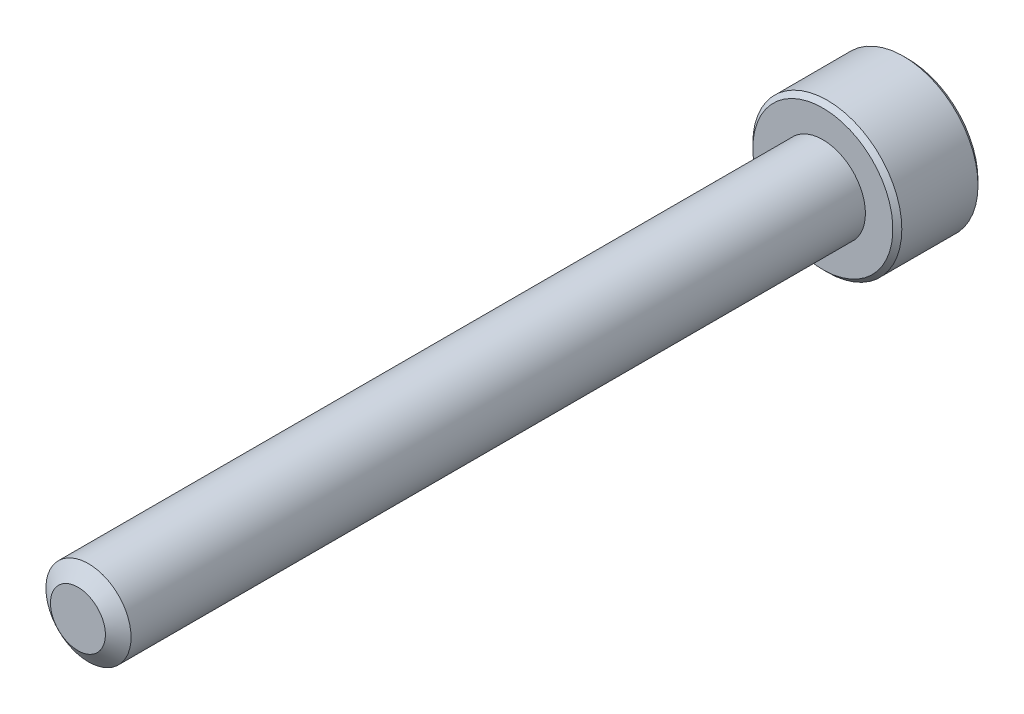
ISO-10303-21;
HEADER;
FILE_DESCRIPTION(('STEP AP214'),'2;1');
FILE_NAME('part.step','',(''),(''),'','','');
FILE_SCHEMA(('AUTOMOTIVE_DESIGN { 1 0 10303 214 1 1 1 1 }'));
ENDSEC;
DATA;
#1=APPLICATION_CONTEXT('core data for automotive mechanical design processes');
#2=APPLICATION_PROTOCOL_DEFINITION('international standard','automotive_design',2000,#1);
#3=PRODUCT_CONTEXT('',#1,'mechanical');
#4=PRODUCT('Part','Part','',(#3));
#5=PRODUCT_RELATED_PRODUCT_CATEGORY('part','',(#4));
#6=PRODUCT_DEFINITION_FORMATION('','',#4);
#7=PRODUCT_DEFINITION_CONTEXT('part definition',#1,'design');
#8=PRODUCT_DEFINITION('design','',#6,#7);
#9=PRODUCT_DEFINITION_SHAPE('','',#8);
#10=(LENGTH_UNIT() NAMED_UNIT(*) SI_UNIT(.MILLI.,.METRE.));
#11=(NAMED_UNIT(*) PLANE_ANGLE_UNIT() SI_UNIT($,.RADIAN.));
#12=(NAMED_UNIT(*) SI_UNIT($,.STERADIAN.) SOLID_ANGLE_UNIT());
#13=UNCERTAINTY_MEASURE_WITH_UNIT(LENGTH_MEASURE(1.E-05),#10,'distance_accuracy_value','');
#14=(GEOMETRIC_REPRESENTATION_CONTEXT(3) GLOBAL_UNCERTAINTY_ASSIGNED_CONTEXT((#13)) GLOBAL_UNIT_ASSIGNED_CONTEXT((#10,
#11,#12)) REPRESENTATION_CONTEXT('',''));
#15=CARTESIAN_POINT('',(0.,0.,0.));
#16=DIRECTION('',(0.,0.,1.));
#17=DIRECTION('',(1.,0.,0.));
#18=AXIS2_PLACEMENT_3D('',#15,#16,#17);
#19=CARTESIAN_POINT('',(0.,0.,-35.));
#20=DIRECTION('',(0.,0.,1.));
#21=DIRECTION('',(1.,0.,0.));
#22=AXIS2_PLACEMENT_3D('',#19,#20,#21);
#23=CYLINDRICAL_SURFACE('',#22,2.);
#24=CARTESIAN_POINT('',(0.,0.,-0.496211410611026));
#25=DIRECTION('',(0.,0.,1.));
#26=DIRECTION('',(1.,0.,0.));
#27=AXIS2_PLACEMENT_3D('',#24,#25,#26);
#28=CIRCLE('',#27,2.);
#29=CARTESIAN_POINT('',(2.,0.,-0.496211410611026));
#30=VERTEX_POINT('',#29);
#31=EDGE_CURVE('E120',#30,#30,#28,.T.);
#32=ORIENTED_EDGE('',*,*,#31,.F.);
#33=EDGE_LOOP('',(#32));
#34=FACE_BOUND('',#33,.T.);
#35=CARTESIAN_POINT('',(0.,0.,-35.));
#36=DIRECTION('',(0.,0.,-1.));
#37=DIRECTION('',(-1.,0.,0.));
#38=AXIS2_PLACEMENT_3D('',#35,#36,#37);
#39=CIRCLE('',#38,2.);
#40=CARTESIAN_POINT('',(-2.,0.,-35.));
#41=VERTEX_POINT('',#40);
#42=EDGE_CURVE('E231',#41,#41,#39,.F.);
#43=ORIENTED_EDGE('',*,*,#42,.T.);
#44=EDGE_LOOP('',(#43));
#45=FACE_BOUND('',#44,.T.);
#46=ADVANCED_FACE('F40',(#34,#45),#23,.T.);
#47=CARTESIAN_POINT('',(0.,0.,0.));
#48=DIRECTION('',(0.,0.,-1.));
#49=DIRECTION('',(-1.,0.,0.));
#50=AXIS2_PLACEMENT_3D('',#47,#48,#49);
#51=CONICAL_SURFACE('',#50,1.29133666301317,0.959931088596884);
#52=ORIENTED_EDGE('',*,*,#31,.T.);
#53=EDGE_LOOP('',(#52));
#54=FACE_BOUND('',#53,.T.);
#55=CARTESIAN_POINT('',(0.,0.,0.));
#56=DIRECTION('',(0.,0.,1.));
#57=DIRECTION('',(1.,0.,0.));
#58=AXIS2_PLACEMENT_3D('',#55,#56,#57);
#59=CIRCLE('',#58,1.29133666301317);
#60=CARTESIAN_POINT('',(1.29133666301317,0.,0.));
#61=VERTEX_POINT('',#60);
#62=EDGE_CURVE('E228',#61,#61,#59,.T.);
#63=ORIENTED_EDGE('',*,*,#62,.F.);
#64=EDGE_LOOP('',(#63));
#65=FACE_BOUND('',#64,.T.);
#66=ADVANCED_FACE('F211',(#54,#65),#51,.T.);
#67=CARTESIAN_POINT('',(0.,0.,0.));
#68=DIRECTION('',(0.,0.,1.));
#69=DIRECTION('',(1.,0.,0.));
#70=AXIS2_PLACEMENT_3D('',#67,#68,#69);
#71=PLANE('',#70);
#72=ORIENTED_EDGE('',*,*,#62,.T.);
#73=EDGE_LOOP('',(#72));
#74=FACE_BOUND('',#73,.T.);
#75=ADVANCED_FACE('F208',(#74),#71,.T.);
#76=CARTESIAN_POINT('',(0.,0.,-39.));
#77=DIRECTION('',(0.,0.,1.));
#78=DIRECTION('',(1.,0.,0.));
#79=AXIS2_PLACEMENT_3D('',#76,#77,#78);
#80=CYLINDRICAL_SURFACE('',#79,3.5);
#81=CARTESIAN_POINT('',(0.,0.,-38.79));
#82=DIRECTION('',(0.,0.,-1.));
#83=DIRECTION('',(-1.,0.,0.));
#84=AXIS2_PLACEMENT_3D('',#81,#82,#83);
#85=CIRCLE('',#84,3.5);
#86=CARTESIAN_POINT('',(3.5,0.,-38.79));
#87=VERTEX_POINT('',#86);
#88=EDGE_CURVE('E49',#87,#87,#85,.F.);
#89=CARTESIAN_POINT('',(0.,0.,-35.21));
#90=DIRECTION('',(0.,0.,-1.));
#91=DIRECTION('',(-1.,0.,0.));
#92=AXIS2_PLACEMENT_3D('',#89,#90,#91);
#93=CIRCLE('',#92,3.5);
#94=CARTESIAN_POINT('',(3.5,0.,-35.21));
#95=VERTEX_POINT('',#94);
#96=EDGE_CURVE('E185',#95,#95,#93,.T.);
#97=CARTESIAN_POINT('',(3.5,0.,-38.79));
#98=CARTESIAN_POINT('',(3.5,0.,-38.7527083333333));
#99=CARTESIAN_POINT('',(3.5,0.,-38.7154166666667));
#100=CARTESIAN_POINT('',(3.5,0.,-38.6408333333333));
#101=CARTESIAN_POINT('',(3.5,0.,-38.6035416666667));
#102=CARTESIAN_POINT('',(3.5,0.,-38.5289583333333));
#103=CARTESIAN_POINT('',(3.5,0.,-38.4916666666667));
#104=CARTESIAN_POINT('',(3.5,0.,-38.4170833333333));
#105=CARTESIAN_POINT('',(3.5,0.,-38.3797916666667));
#106=CARTESIAN_POINT('',(3.5,0.,-38.3052083333333));
#107=CARTESIAN_POINT('',(3.5,0.,-38.2679166666667));
#108=CARTESIAN_POINT('',(3.5,0.,-38.1933333333333));
#109=CARTESIAN_POINT('',(3.5,0.,-38.1560416666667));
#110=CARTESIAN_POINT('',(3.5,0.,-38.0814583333333));
#111=CARTESIAN_POINT('',(3.5,0.,-38.0441666666667));
#112=CARTESIAN_POINT('',(3.5,0.,-37.9695833333333));
#113=CARTESIAN_POINT('',(3.5,0.,-37.9322916666667));
#114=CARTESIAN_POINT('',(3.5,0.,-37.8577083333333));
#115=CARTESIAN_POINT('',(3.5,0.,-37.8204166666667));
#116=CARTESIAN_POINT('',(3.5,0.,-37.7458333333333));
#117=CARTESIAN_POINT('',(3.5,0.,-37.7085416666667));
#118=CARTESIAN_POINT('',(3.5,0.,-37.6339583333333));
#119=CARTESIAN_POINT('',(3.5,0.,-37.5966666666667));
#120=CARTESIAN_POINT('',(3.5,0.,-37.5220833333333));
#121=CARTESIAN_POINT('',(3.5,0.,-37.4847916666667));
#122=CARTESIAN_POINT('',(3.5,0.,-37.4102083333333));
#123=CARTESIAN_POINT('',(3.5,0.,-37.3729166666667));
#124=CARTESIAN_POINT('',(3.5,0.,-37.2983333333333));
#125=CARTESIAN_POINT('',(3.5,0.,-37.2610416666667));
#126=CARTESIAN_POINT('',(3.5,0.,-37.1864583333333));
#127=CARTESIAN_POINT('',(3.5,0.,-37.1491666666667));
#128=CARTESIAN_POINT('',(3.5,0.,-37.0745833333333));
#129=CARTESIAN_POINT('',(3.5,0.,-37.0372916666667));
#130=CARTESIAN_POINT('',(3.5,0.,-36.9627083333333));
#131=CARTESIAN_POINT('',(3.5,0.,-36.9254166666667));
#132=CARTESIAN_POINT('',(3.5,0.,-36.8508333333333));
#133=CARTESIAN_POINT('',(3.5,0.,-36.8135416666667));
#134=CARTESIAN_POINT('',(3.5,0.,-36.7389583333333));
#135=CARTESIAN_POINT('',(3.5,0.,-36.7016666666667));
#136=CARTESIAN_POINT('',(3.5,0.,-36.6270833333333));
#137=CARTESIAN_POINT('',(3.5,0.,-36.5897916666667));
#138=CARTESIAN_POINT('',(3.5,0.,-36.5152083333333));
#139=CARTESIAN_POINT('',(3.5,0.,-36.4779166666667));
#140=CARTESIAN_POINT('',(3.5,0.,-36.4033333333333));
#141=CARTESIAN_POINT('',(3.5,0.,-36.3660416666667));
#142=CARTESIAN_POINT('',(3.5,0.,-36.2914583333333));
#143=CARTESIAN_POINT('',(3.5,0.,-36.2541666666667));
#144=CARTESIAN_POINT('',(3.5,0.,-36.1795833333333));
#145=CARTESIAN_POINT('',(3.5,0.,-36.1422916666667));
#146=CARTESIAN_POINT('',(3.5,0.,-36.0677083333333));
#147=CARTESIAN_POINT('',(3.5,0.,-36.0304166666667));
#148=CARTESIAN_POINT('',(3.5,0.,-35.9558333333333));
#149=CARTESIAN_POINT('',(3.5,0.,-35.9185416666667));
#150=CARTESIAN_POINT('',(3.5,0.,-35.8439583333333));
#151=CARTESIAN_POINT('',(3.5,0.,-35.8066666666667));
#152=CARTESIAN_POINT('',(3.5,0.,-35.7320833333333));
#153=CARTESIAN_POINT('',(3.5,0.,-35.6947916666667));
#154=CARTESIAN_POINT('',(3.5,0.,-35.6202083333333));
#155=CARTESIAN_POINT('',(3.5,0.,-35.5829166666667));
#156=CARTESIAN_POINT('',(3.5,0.,-35.5083333333333));
#157=CARTESIAN_POINT('',(3.5,0.,-35.4710416666667));
#158=CARTESIAN_POINT('',(3.5,0.,-35.3964583333333));
#159=CARTESIAN_POINT('',(3.5,0.,-35.3591666666667));
#160=CARTESIAN_POINT('',(3.5,0.,-35.2845833333333));
#161=CARTESIAN_POINT('',(3.5,0.,-35.2472916666667));
#162=CARTESIAN_POINT('',(3.5,0.,-35.21));
#163=B_SPLINE_CURVE_WITH_KNOTS('',3,(#97,#98,#99,#100,#101,#102,#103,#104,#105,#106,#107,#108,
#109,#110,#111,#112,#113,#114,#115,#116,#117,#118,#119,#120,#121,#122,#123,#124,#125,#126,#127,
#128,#129,#130,#131,#132,#133,#134,#135,#136,#137,#138,#139,#140,#141,#142,#143,#144,#145,#146,
#147,#148,#149,#150,#151,#152,#153,#154,#155,#156,#157,#158,#159,#160,#161,#162),.UNSPECIFIED.,
.F.,.F.,(4,2,2,2,2,2,2,2,2,2,2,2,2,2,2,2,2,2,2,2,2,2,2,2,2,2,2,2,2,2,2,2,4),(0.,
0.111875000000004,0.223750000000002,0.335625000000006,0.447500000000003,0.559375000000008,
0.671250000000005,0.783125000000003,0.895000000000007,1.006875,1.11875000000001,
1.23062500000001,1.3425,1.45437500000001,1.56625000000001,1.67812500000001,1.79000000000001,
1.901875,2.01375000000001,2.12562500000001,2.23750000000001,2.34937500000001,2.46125000000001,
2.57312500000001,2.68500000000001,2.79687500000001,2.90875000000001,3.02062500000001,
3.13250000000001,3.24437500000001,3.35625000000001,3.46812500000001,3.58000000000001),.UNSPECIFIED.);
#164=EDGE_CURVE('BSEAM192',#87,#95,#163,.T.);
#165=ORIENTED_EDGE('',*,*,#88,.T.);
#166=ORIENTED_EDGE('',*,*,#96,.T.);
#167=ORIENTED_EDGE('',*,*,#164,.T.);
#168=ORIENTED_EDGE('',*,*,#164,.F.);
#169=EDGE_LOOP('',(#165,#167,#166,#168));
#170=FACE_BOUND('',#169,.T.);
#171=ADVANCED_FACE('F192',(#170),#80,.T.);
#172=CARTESIAN_POINT('',(0.,0.,-39.));
#173=DIRECTION('',(0.,0.,-1.));
#174=DIRECTION('',(-1.,0.,0.));
#175=AXIS2_PLACEMENT_3D('',#172,#173,#174);
#176=PLANE('',#175);
#177=CARTESIAN_POINT('',(0.,0.,-39.));
#178=DIRECTION('',(0.,0.,-1.));
#179=DIRECTION('',(-1.,0.,0.));
#180=AXIS2_PLACEMENT_3D('',#177,#178,#179);
#181=CIRCLE('',#180,3.29);
#182=CARTESIAN_POINT('',(3.29,0.,-39.));
#183=VERTEX_POINT('',#182);
#184=EDGE_CURVE('E119',#183,#183,#181,.T.);
#185=ORIENTED_EDGE('',*,*,#184,.T.);
#186=EDGE_LOOP('',(#185));
#187=FACE_BOUND('',#186,.T.);
#188=CARTESIAN_POINT('',(0.,0.,-39.));
#189=DIRECTION('',(0.,0.,-1.));
#190=DIRECTION('',(-1.,0.,0.));
#191=AXIS2_PLACEMENT_3D('',#188,#189,#190);
#192=CIRCLE('',#191,1.73205080756888);
#193=CARTESIAN_POINT('',(-1.5,0.866025403784439,-39.));
#194=VERTEX_POINT('',#193);
#195=CARTESIAN_POINT('',(0.,1.73205080756888,-39.));
#196=VERTEX_POINT('',#195);
#197=EDGE_CURVE('E99',#194,#196,#192,.T.);
#198=ORIENTED_EDGE('',*,*,#197,.F.);
#199=CARTESIAN_POINT('',(-1.5,-0.866025403784438,-39.));
#200=VERTEX_POINT('',#199);
#201=EDGE_CURVE('E57',#200,#194,#192,.T.);
#202=ORIENTED_EDGE('',*,*,#201,.F.);
#203=CARTESIAN_POINT('',(0.,-1.73205080756888,-39.));
#204=VERTEX_POINT('',#203);
#205=EDGE_CURVE('E299',#204,#200,#192,.T.);
#206=ORIENTED_EDGE('',*,*,#205,.F.);
#207=CARTESIAN_POINT('',(1.5,-0.866025403784438,-39.));
#208=VERTEX_POINT('',#207);
#209=EDGE_CURVE('E64',#208,#204,#192,.T.);
#210=ORIENTED_EDGE('',*,*,#209,.F.);
#211=CARTESIAN_POINT('',(1.5,0.866025403784439,-39.));
#212=VERTEX_POINT('',#211);
#213=EDGE_CURVE('E142',#212,#208,#192,.T.);
#214=ORIENTED_EDGE('',*,*,#213,.F.);
#215=EDGE_CURVE('E109',#196,#212,#192,.T.);
#216=ORIENTED_EDGE('',*,*,#215,.F.);
#217=EDGE_LOOP('',(#198,#202,#206,#210,#214,#216));
#218=FACE_BOUND('',#217,.T.);
#219=ADVANCED_FACE('F141',(#187,#218),#176,.T.);
#220=CARTESIAN_POINT('',(0.,0.,-35.));
#221=DIRECTION('',(0.,0.,-1.));
#222=DIRECTION('',(-1.,0.,0.));
#223=AXIS2_PLACEMENT_3D('',#220,#221,#222);
#224=PLANE('',#223);
#225=CARTESIAN_POINT('',(0.,0.,-35.));
#226=DIRECTION('',(0.,0.,-1.));
#227=DIRECTION('',(-1.,0.,0.));
#228=AXIS2_PLACEMENT_3D('',#225,#226,#227);
#229=CIRCLE('',#228,3.29000000000001);
#230=CARTESIAN_POINT('',(-3.29000000000001,0.,-35.));
#231=VERTEX_POINT('',#230);
#232=EDGE_CURVE('E11',#231,#231,#229,.F.);
#233=ORIENTED_EDGE('',*,*,#232,.T.);
#234=EDGE_LOOP('',(#233));
#235=FACE_BOUND('',#234,.T.);
#236=ORIENTED_EDGE('',*,*,#42,.F.);
#237=EDGE_LOOP('',(#236));
#238=FACE_BOUND('',#237,.T.);
#239=ADVANCED_FACE('F201',(#235,#238),#224,.F.);
#240=CARTESIAN_POINT('',(0.,0.,-39.));
#241=DIRECTION('',(0.,0.,-1.));
#242=DIRECTION('',(-1.,0.,0.));
#243=AXIS2_PLACEMENT_3D('',#240,#241,#242);
#244=CONICAL_SURFACE('',#243,1.73205080756888,0.78539816339745);
#245=ORIENTED_EDGE('',*,*,#215,.T.);
#246=CARTESIAN_POINT('',(-0.000199999999999787,1.73216627762271,-39.0001154816001));
#247=CARTESIAN_POINT('',(0.051367790737077,1.70239359975915,-38.9703654760673));
#248=CARTESIAN_POINT('',(0.103797917665202,1.67212305186355,-38.9423624839103));
#249=CARTESIAN_POINT('',(0.210709034055598,1.61039789003619,-38.8910892304402));
#250=CARTESIAN_POINT('',(0.265200195814661,1.57893740312614,-38.8678475050444));
#251=CARTESIAN_POINT('',(0.375079081357247,1.51549879897987,-38.8280337289922));
#252=CARTESIAN_POINT('',(0.430438809095198,1.4835368452681,-38.8113615856709));
#253=CARTESIAN_POINT('',(0.542377257477149,1.41890915196211,-38.7856744568181));
#254=CARTESIAN_POINT('',(0.598952556553006,1.38624538781118,-38.7766402904789));
#255=CARTESIAN_POINT('',(0.696455389516438,1.329952100953,-38.7684890812269));
#256=CARTESIAN_POINT('',(0.737256908280464,1.30639533311124,-38.7672822529892));
#257=CARTESIAN_POINT('',(0.818787969615856,1.25932335290194,-38.7693140571623));
#258=CARTESIAN_POINT('',(0.859517494314627,1.23580815085313,-38.7725536707483));
#259=CARTESIAN_POINT('',(0.940584402163413,1.18900414978427,-38.783291985982));
#260=CARTESIAN_POINT('',(0.980921384598285,1.1657155821172,-38.7907946530187));
#261=CARTESIAN_POINT('',(1.06091833691403,1.11952932016335,-38.8096516119283));
#262=CARTESIAN_POINT('',(1.1005780085162,1.09663179808786,-38.8210075570186));
#263=CARTESIAN_POINT('',(1.20216313477448,1.03798159809699,-38.8547216475927));
#264=CARTESIAN_POINT('',(1.26345855370969,1.00259267147465,-38.8796218490934));
#265=CARTESIAN_POINT('',(1.35358562846331,0.950557780604375,-38.9216566532716));
#266=CARTESIAN_POINT('',(1.38328513990772,0.933410759677148,-38.9364251535591));
#267=CARTESIAN_POINT('',(1.44213790138375,0.899432101996407,-38.9673105659402));
#268=CARTESIAN_POINT('',(1.47129140422064,0.88260031928571,-38.9834268341217));
#269=CARTESIAN_POINT('',(1.5002,0.865909933730601,-39.0001154816001));
#270=B_SPLINE_CURVE_WITH_KNOTS('',3,(#246,#247,#248,#249,#250,#251,#252,#253,#254,#255,#256,
#257,#258,#259,#260,#261,#262,#263,#264,#265,#266,#267,#268,#269),.UNSPECIFIED.,.F.,.F.,(4,2,2,
2,2,2,2,2,2,2,2,4),(0.,0.199829143693305,0.400822987382388,0.598623720538179,0.795926240188886,
0.937113067959878,1.07833105577192,1.21968061668222,1.36109089931054,1.58570969637565,
1.69770705470963,1.80965120737194),.UNSPECIFIED.);
#271=EDGE_CURVE('E114',#196,#212,#270,.T.);
#272=ORIENTED_EDGE('',*,*,#271,.F.);
#273=EDGE_LOOP('',(#245,#272));
#274=FACE_BOUND('',#273,.T.);
#275=ADVANCED_FACE('F115',(#274),#244,.F.);
#276=ORIENTED_EDGE('',*,*,#213,.T.);
#277=CARTESIAN_POINT('',(1.5,-1.72720812994823,-39.5555785164605));
#278=CARTESIAN_POINT('',(1.5,-1.68515175723693,-39.5238299080399));
#279=CARTESIAN_POINT('',(1.5,-1.64286104772391,-39.4923925939825));
#280=CARTESIAN_POINT('',(1.5,-1.55771581058238,-39.430269087717));
#281=CARTESIAN_POINT('',(1.5,-1.5148611440825,-39.3995830860455));
#282=CARTESIAN_POINT('',(1.5,-1.38468134170665,-39.3084071925586));
#283=CARTESIAN_POINT('',(1.5,-1.29637976089562,-39.2492883435437));
#284=CARTESIAN_POINT('',(1.5,-1.11121478745132,-39.1332309964035));
#285=CARTESIAN_POINT('',(1.5,-1.01415038251068,-39.0766095588047));
#286=CARTESIAN_POINT('',(1.5,-0.815173408989817,-38.9730368813091));
#287=CARTESIAN_POINT('',(1.5,-0.713278669326362,-38.9260530415721));
#288=CARTESIAN_POINT('',(1.5,-0.560333775001793,-38.8685726684516));
#289=CARTESIAN_POINT('',(1.5,-0.511547983012752,-38.8520753877783));
#290=CARTESIAN_POINT('',(1.5,-0.41279862021383,-38.8229975129476));
#291=CARTESIAN_POINT('',(1.5,-0.362834968520751,-38.8104171886138));
#292=CARTESIAN_POINT('',(1.5,-0.262863235540415,-38.7900361941635));
#293=CARTESIAN_POINT('',(1.5,-0.212872113909473,-38.7821536327605));
#294=CARTESIAN_POINT('',(1.5,-0.112355243682829,-38.7713220639777));
#295=CARTESIAN_POINT('',(1.5,-0.061829588491727,-38.7683722085295));
#296=CARTESIAN_POINT('',(1.5,0.037429173202554,-38.7676248577218));
#297=CARTESIAN_POINT('',(1.5,0.0861609670655383,-38.7696447335505));
#298=CARTESIAN_POINT('',(1.5,0.183206937624699,-38.7783225528794));
#299=CARTESIAN_POINT('',(1.5,0.231521073289704,-38.7849809469459));
#300=CARTESIAN_POINT('',(1.5,0.328199853268112,-38.802685244089));
#301=CARTESIAN_POINT('',(1.5,0.376550616148695,-38.8138058112178));
#302=CARTESIAN_POINT('',(1.5,0.472195696955764,-38.8398434139978));
#303=CARTESIAN_POINT('',(1.5,0.519490102919014,-38.8547601319841));
#304=CARTESIAN_POINT('',(1.5,0.668391282485069,-38.9073352235115));
#305=CARTESIAN_POINT('',(1.5,0.767878709264958,-38.9509812873618));
#306=CARTESIAN_POINT('',(1.5,0.962179866385509,-39.0480229944291));
#307=CARTESIAN_POINT('',(1.5,1.05697519927966,-39.1014536648971));
#308=CARTESIAN_POINT('',(1.5,1.23814273494589,-39.2116858517578));
#309=CARTESIAN_POINT('',(1.5,1.32469942140118,-39.2681879204262));
#310=CARTESIAN_POINT('',(1.5,1.45222331245986,-39.3555343012679));
#311=CARTESIAN_POINT('',(1.5,1.49418091932914,-39.3849577583565));
#312=CARTESIAN_POINT('',(1.5,1.57752272883331,-39.4445828214816));
#313=CARTESIAN_POINT('',(1.5,1.61890708598062,-39.4747842113029));
#314=CARTESIAN_POINT('',(1.5,1.66005277969055,-39.5053081782352));
#315=B_SPLINE_CURVE_WITH_KNOTS('',3,(#277,#278,#279,#280,#281,#282,#283,#284,#285,#286,#287,
#288,#289,#290,#291,#292,#293,#294,#295,#296,#297,#298,#299,#300,#301,#302,#303,#304,#305,#306,
#307,#308,#309,#310,#311,#312,#313,#314),.UNSPECIFIED.,.F.,.F.,(4,2,2,2,2,2,2,2,2,2,2,2,2,2,2,2,
2,2,4),(0.,0.158079549012756,0.316198781054131,0.634850417468462,0.971690311551782,
1.30737131686505,1.46173961151184,1.61611853763032,1.76772101442095,1.91929742387555,
2.06538741227089,2.21149159321504,2.36014984648185,2.50879566399377,2.83376031423512,
3.15991186974584,3.46985601780942,3.62358896013694,3.77727962610766),.UNSPECIFIED.);
#316=EDGE_CURVE('E108',#212,#208,#315,.F.);
#317=ORIENTED_EDGE('',*,*,#316,.F.);
#318=EDGE_LOOP('',(#276,#317));
#319=FACE_BOUND('',#318,.T.);
#320=ADVANCED_FACE('F307',(#319),#244,.F.);
#321=ORIENTED_EDGE('',*,*,#209,.T.);
#322=CARTESIAN_POINT('',(1.5002,-0.865909933730601,-39.0001154816001));
#323=CARTESIAN_POINT('',(1.44863220926292,-0.895682611594166,-38.9703654760673));
#324=CARTESIAN_POINT('',(1.3962020823348,-0.925953159489766,-38.9423624839103));
#325=CARTESIAN_POINT('',(1.2892909659444,-0.987678321317124,-38.8910892304402));
#326=CARTESIAN_POINT('',(1.23479980418534,-1.01913880822717,-38.8678475050444));
#327=CARTESIAN_POINT('',(1.12492091864275,-1.08257741237344,-38.8280337289922));
#328=CARTESIAN_POINT('',(1.0695611909048,-1.11453936608521,-38.8113615856709));
#329=CARTESIAN_POINT('',(0.957622742522852,-1.1791670593912,-38.7856744568181));
#330=CARTESIAN_POINT('',(0.901047443446994,-1.21183082354213,-38.7766402904789));
#331=CARTESIAN_POINT('',(0.803544610483562,-1.26812411040032,-38.7684890812269));
#332=CARTESIAN_POINT('',(0.762743091719536,-1.29168087824208,-38.7672822529892));
#333=CARTESIAN_POINT('',(0.681212030384144,-1.33875285845138,-38.7693140571623));
#334=CARTESIAN_POINT('',(0.640482505685373,-1.36226806050018,-38.7725536707483));
#335=CARTESIAN_POINT('',(0.559415597836586,-1.40907206156905,-38.783291985982));
#336=CARTESIAN_POINT('',(0.519078615401714,-1.43236062923612,-38.7907946530187));
#337=CARTESIAN_POINT('',(0.439081663085971,-1.47854689118996,-38.8096516119283));
#338=CARTESIAN_POINT('',(0.399421991483795,-1.50144441326545,-38.8210075570186));
#339=CARTESIAN_POINT('',(0.297836865225518,-1.56009461325633,-38.8547216475927));
#340=CARTESIAN_POINT('',(0.236541446290315,-1.59548353987866,-38.8796218490934));
#341=CARTESIAN_POINT('',(0.146414371536689,-1.64751843074894,-38.9216566532716));
#342=CARTESIAN_POINT('',(0.116714860092283,-1.66466545167617,-38.9364251535591));
#343=CARTESIAN_POINT('',(0.0578620986162487,-1.69864410935691,-38.9673105659402));
#344=CARTESIAN_POINT('',(0.0287085957793622,-1.71547589206761,-38.9834268341217));
#345=CARTESIAN_POINT('',(-0.000200000000000087,-1.73216627762271,-39.0001154816001));
#346=B_SPLINE_CURVE_WITH_KNOTS('',3,(#322,#323,#324,#325,#326,#327,#328,#329,#330,#331,#332,
#333,#334,#335,#336,#337,#338,#339,#340,#341,#342,#343,#344,#345),.UNSPECIFIED.,.F.,.F.,(4,2,2,
2,2,2,2,2,2,2,2,4),(0.,0.199829143693306,0.400822987382388,0.598623720538179,0.795926240188886,
0.937113067959878,1.07833105577192,1.21968061668222,1.36109089931054,1.58570969637565,
1.69770705470963,1.80965120737194),.UNSPECIFIED.);
#347=EDGE_CURVE('E152',#208,#204,#346,.T.);
#348=ORIENTED_EDGE('',*,*,#347,.F.);
#349=EDGE_LOOP('',(#321,#348));
#350=FACE_BOUND('',#349,.T.);
#351=ADVANCED_FACE('F304',(#350),#244,.F.);
#352=ORIENTED_EDGE('',*,*,#205,.T.);
#353=CARTESIAN_POINT('',(0.000200000000000512,-1.73216627762271,-39.0001154816001));
#354=CARTESIAN_POINT('',(-0.0513677907370765,-1.70239359975915,-38.9703654760673));
#355=CARTESIAN_POINT('',(-0.103797917665202,-1.67212305186355,-38.9423624839103));
#356=CARTESIAN_POINT('',(-0.210709034055597,-1.61039789003619,-38.8910892304402));
#357=CARTESIAN_POINT('',(-0.265200195814661,-1.57893740312614,-38.8678475050444));
#358=CARTESIAN_POINT('',(-0.375079081357247,-1.51549879897987,-38.8280337289922));
#359=CARTESIAN_POINT('',(-0.430438809095198,-1.4835368452681,-38.8113615856709));
#360=CARTESIAN_POINT('',(-0.542377257477149,-1.41890915196211,-38.7856744568181));
#361=CARTESIAN_POINT('',(-0.598952556553006,-1.38624538781118,-38.7766402904789));
#362=CARTESIAN_POINT('',(-0.696455389516438,-1.329952100953,-38.7684890812269));
#363=CARTESIAN_POINT('',(-0.737256908280463,-1.30639533311124,-38.7672822529892));
#364=CARTESIAN_POINT('',(-0.818787969615854,-1.25932335290194,-38.7693140571623));
#365=CARTESIAN_POINT('',(-0.859517494314626,-1.23580815085314,-38.7725536707483));
#366=CARTESIAN_POINT('',(-0.940584402163412,-1.18900414978427,-38.783291985982));
#367=CARTESIAN_POINT('',(-0.980921384598284,-1.1657155821172,-38.7907946530187));
#368=CARTESIAN_POINT('',(-1.06091833691403,-1.11952932016335,-38.8096516119283));
#369=CARTESIAN_POINT('',(-1.1005780085162,-1.09663179808786,-38.8210075570186));
#370=CARTESIAN_POINT('',(-1.20216313477448,-1.03798159809699,-38.8547216475927));
#371=CARTESIAN_POINT('',(-1.26345855370969,-1.00259267147465,-38.8796218490934));
#372=CARTESIAN_POINT('',(-1.35358562846331,-0.950557780604375,-38.9216566532716));
#373=CARTESIAN_POINT('',(-1.38328513990772,-0.933410759677149,-38.9364251535591));
#374=CARTESIAN_POINT('',(-1.44213790138375,-0.899432101996408,-38.9673105659402));
#375=CARTESIAN_POINT('',(-1.47129140422064,-0.882600319285711,-38.9834268341217));
#376=CARTESIAN_POINT('',(-1.5002,-0.865909933730601,-39.0001154816001));
#377=B_SPLINE_CURVE_WITH_KNOTS('',3,(#353,#354,#355,#356,#357,#358,#359,#360,#361,#362,#363,
#364,#365,#366,#367,#368,#369,#370,#371,#372,#373,#374,#375,#376),.UNSPECIFIED.,.F.,.F.,(4,2,2,
2,2,2,2,2,2,2,2,4),(0.,0.199829143693306,0.400822987382388,0.59862372053818,0.795926240188887,
0.937113067959878,1.07833105577192,1.21968061668222,1.36109089931054,1.58570969637565,
1.69770705470963,1.80965120737194),.UNSPECIFIED.);
#378=EDGE_CURVE('E276',#204,#200,#377,.T.);
#379=ORIENTED_EDGE('',*,*,#378,.F.);
#380=EDGE_LOOP('',(#352,#379));
#381=FACE_BOUND('',#380,.T.);
#382=ADVANCED_FACE('F313',(#381),#244,.F.);
#383=ORIENTED_EDGE('',*,*,#201,.T.);
#384=CARTESIAN_POINT('',(-1.5,-1.72720812994823,-39.5555785164605));
#385=CARTESIAN_POINT('',(-1.5,-1.68515175723693,-39.5238299080399));
#386=CARTESIAN_POINT('',(-1.5,-1.64286104772391,-39.4923925939825));
#387=CARTESIAN_POINT('',(-1.5,-1.55771581058238,-39.430269087717));
#388=CARTESIAN_POINT('',(-1.5,-1.51486114408249,-39.3995830860455));
#389=CARTESIAN_POINT('',(-1.5,-1.38468134170665,-39.3084071925586));
#390=CARTESIAN_POINT('',(-1.5,-1.29637976089562,-39.2492883435437));
#391=CARTESIAN_POINT('',(-1.5,-1.11121478745132,-39.1332309964035));
#392=CARTESIAN_POINT('',(-1.5,-1.01415038251068,-39.0766095588047));
#393=CARTESIAN_POINT('',(-1.5,-0.815173408989816,-38.9730368813091));
#394=CARTESIAN_POINT('',(-1.5,-0.713278669326361,-38.9260530415721));
#395=CARTESIAN_POINT('',(-1.5,-0.560333775001793,-38.8685726684516));
#396=CARTESIAN_POINT('',(-1.5,-0.511547983012752,-38.8520753877783));
#397=CARTESIAN_POINT('',(-1.5,-0.41279862021383,-38.8229975129476));
#398=CARTESIAN_POINT('',(-1.5,-0.362834968520751,-38.8104171886138));
#399=CARTESIAN_POINT('',(-1.5,-0.262863235540416,-38.7900361941635));
#400=CARTESIAN_POINT('',(-1.5,-0.212872113909475,-38.7821536327605));
#401=CARTESIAN_POINT('',(-1.5,-0.112355243682831,-38.7713220639777));
#402=CARTESIAN_POINT('',(-1.5,-0.061829588491729,-38.7683722085295));
#403=CARTESIAN_POINT('',(-1.5,0.0374291732025524,-38.7676248577218));
#404=CARTESIAN_POINT('',(-1.5,0.0861609670655375,-38.7696447335505));
#405=CARTESIAN_POINT('',(-1.5,0.183206937624698,-38.7783225528794));
#406=CARTESIAN_POINT('',(-1.5,0.231521073289703,-38.7849809469459));
#407=CARTESIAN_POINT('',(-1.5,0.328199853268112,-38.802685244089));
#408=CARTESIAN_POINT('',(-1.5,0.376550616148696,-38.8138058112178));
#409=CARTESIAN_POINT('',(-1.5,0.472195696955766,-38.8398434139978));
#410=CARTESIAN_POINT('',(-1.5,0.519490102919015,-38.8547601319841));
#411=CARTESIAN_POINT('',(-1.5,0.66839128248507,-38.9073352235115));
#412=CARTESIAN_POINT('',(-1.5,0.767878709264959,-38.9509812873618));
#413=CARTESIAN_POINT('',(-1.5,0.962179866385511,-39.0480229944291));
#414=CARTESIAN_POINT('',(-1.5,1.05697519927966,-39.1014536648971));
#415=CARTESIAN_POINT('',(-1.5,1.2381427349459,-39.2116858517578));
#416=CARTESIAN_POINT('',(-1.5,1.32469942140119,-39.2681879204262));
#417=CARTESIAN_POINT('',(-1.5,1.45222331245986,-39.3555343012679));
#418=CARTESIAN_POINT('',(-1.5,1.49418091932914,-39.3849577583565));
#419=CARTESIAN_POINT('',(-1.5,1.57752272883332,-39.4445828214816));
#420=CARTESIAN_POINT('',(-1.5,1.61890708598062,-39.4747842113029));
#421=CARTESIAN_POINT('',(-1.5,1.66005277969056,-39.5053081782352));
#422=B_SPLINE_CURVE_WITH_KNOTS('',3,(#384,#385,#386,#387,#388,#389,#390,#391,#392,#393,#394,
#395,#396,#397,#398,#399,#400,#401,#402,#403,#404,#405,#406,#407,#408,#409,#410,#411,#412,#413,
#414,#415,#416,#417,#418,#419,#420,#421),.UNSPECIFIED.,.F.,.F.,(4,2,2,2,2,2,2,2,2,2,2,2,2,2,2,2,
2,2,4),(0.,0.158079549012756,0.316198781054131,0.634850417468462,0.971690311551783,
1.30737131686505,1.46173961151184,1.61611853763032,1.76772101442095,1.91929742387554,
2.06538741227089,2.21149159321503,2.36014984648185,2.50879566399377,2.83376031423512,
3.15991186974584,3.46985601780942,3.62358896013694,3.77727962610766),.UNSPECIFIED.);
#423=EDGE_CURVE('E131',#200,#194,#422,.T.);
#424=ORIENTED_EDGE('',*,*,#423,.F.);
#425=EDGE_LOOP('',(#383,#424));
#426=FACE_BOUND('',#425,.T.);
#427=ADVANCED_FACE('F317',(#426),#244,.F.);
#428=ORIENTED_EDGE('',*,*,#197,.T.);
#429=CARTESIAN_POINT('',(-1.5002,0.865909933730601,-39.0001154816001));
#430=CARTESIAN_POINT('',(-1.44863220926292,0.895682611594165,-38.9703654760673));
#431=CARTESIAN_POINT('',(-1.3962020823348,0.925953159489765,-38.9423624839103));
#432=CARTESIAN_POINT('',(-1.2892909659444,0.987678321317123,-38.8910892304401));
#433=CARTESIAN_POINT('',(-1.23479980418534,1.01913880822717,-38.8678475050444));
#434=CARTESIAN_POINT('',(-1.12492091864275,1.08257741237344,-38.8280337289922));
#435=CARTESIAN_POINT('',(-1.0695611909048,1.11453936608521,-38.8113615856709));
#436=CARTESIAN_POINT('',(-0.957622742522851,1.1791670593912,-38.7856744568181));
#437=CARTESIAN_POINT('',(-0.901047443446993,1.21183082354213,-38.7766402904789));
#438=CARTESIAN_POINT('',(-0.803544610483562,1.26812411040032,-38.7684890812269));
#439=CARTESIAN_POINT('',(-0.762743091719536,1.29168087824208,-38.7672822529892));
#440=CARTESIAN_POINT('',(-0.681212030384145,1.33875285845138,-38.7693140571623));
#441=CARTESIAN_POINT('',(-0.640482505685373,1.36226806050018,-38.7725536707483));
#442=CARTESIAN_POINT('',(-0.559415597836587,1.40907206156905,-38.783291985982));
#443=CARTESIAN_POINT('',(-0.519078615401714,1.43236062923612,-38.7907946530187));
#444=CARTESIAN_POINT('',(-0.439081663085972,1.47854689118996,-38.8096516119283));
#445=CARTESIAN_POINT('',(-0.399421991483795,1.50144441326545,-38.8210075570186));
#446=CARTESIAN_POINT('',(-0.297836865225517,1.56009461325633,-38.8547216475927));
#447=CARTESIAN_POINT('',(-0.236541446290311,1.59548353987866,-38.8796218490934));
#448=CARTESIAN_POINT('',(-0.146414371536687,1.64751843074894,-38.9216566532716));
#449=CARTESIAN_POINT('',(-0.116714860092283,1.66466545167617,-38.9364251535591));
#450=CARTESIAN_POINT('',(-0.0578620986162505,1.69864410935691,-38.9673105659402));
#451=CARTESIAN_POINT('',(-0.0287085957793633,1.7154758920676,-38.9834268341217));
#452=CARTESIAN_POINT('',(0.000200000000000817,1.73216627762271,-39.0001154816001));
#453=B_SPLINE_CURVE_WITH_KNOTS('',3,(#429,#430,#431,#432,#433,#434,#435,#436,#437,#438,#439,
#440,#441,#442,#443,#444,#445,#446,#447,#448,#449,#450,#451,#452),.UNSPECIFIED.,.F.,.F.,(4,2,2,
2,2,2,2,2,2,2,2,4),(0.,0.199829143693308,0.400822987382388,0.59862372053818,0.795926240188887,
0.937113067959879,1.07833105577192,1.21968061668222,1.36109089931054,1.58570969637566,
1.69770705470963,1.80965120737194),.UNSPECIFIED.);
#454=EDGE_CURVE('E103',#194,#196,#453,.T.);
#455=ORIENTED_EDGE('',*,*,#454,.F.);
#456=EDGE_LOOP('',(#428,#455));
#457=FACE_BOUND('',#456,.T.);
#458=ADVANCED_FACE('F101',(#457),#244,.F.);
#459=CARTESIAN_POINT('',(1.5,2.59807621135331,-36.75));
#460=DIRECTION('',(0.,0.,-1.));
#461=DIRECTION('',(-1.,0.,0.));
#462=AXIS2_PLACEMENT_3D('',#459,#460,#461);
#463=PLANE('',#462);
#464=DIRECTION('',(0.866025403784439,0.5,0.));
#465=VECTOR('',#464,1.);
#466=CARTESIAN_POINT('',(-1.5,0.866025403784438,-36.75));
#467=LINE('',#466,#465);
#468=CARTESIAN_POINT('',(-1.5,0.866025403784438,-36.75));
#469=VERTEX_POINT('',#468);
#470=CARTESIAN_POINT('',(0.,1.73205080756888,-36.75));
#471=VERTEX_POINT('',#470);
#472=EDGE_CURVE('E130',#469,#471,#467,.T.);
#473=ORIENTED_EDGE('',*,*,#472,.T.);
#474=DIRECTION('',(0.866025403784439,-0.5,0.));
#475=VECTOR('',#474,1.);
#476=CARTESIAN_POINT('',(0.,1.73205080756888,-36.75));
#477=LINE('',#476,#475);
#478=CARTESIAN_POINT('',(1.5,0.866025403784439,-36.75));
#479=VERTEX_POINT('',#478);
#480=EDGE_CURVE('E135',#471,#479,#477,.T.);
#481=ORIENTED_EDGE('',*,*,#480,.T.);
#482=DIRECTION('',(0.,-1.,0.));
#483=VECTOR('',#482,1.);
#484=CARTESIAN_POINT('',(1.5,0.866025403784439,-36.75));
#485=LINE('',#484,#483);
#486=CARTESIAN_POINT('',(1.5,-0.866025403784439,-36.75));
#487=VERTEX_POINT('',#486);
#488=EDGE_CURVE('E260',#479,#487,#485,.T.);
#489=ORIENTED_EDGE('',*,*,#488,.T.);
#490=DIRECTION('',(-0.866025403784439,-0.5,0.));
#491=VECTOR('',#490,1.);
#492=CARTESIAN_POINT('',(1.5,-0.866025403784439,-36.75));
#493=LINE('',#492,#491);
#494=CARTESIAN_POINT('',(0.,-1.73205080756888,-36.75));
#495=VERTEX_POINT('',#494);
#496=EDGE_CURVE('E257',#487,#495,#493,.T.);
#497=ORIENTED_EDGE('',*,*,#496,.T.);
#498=DIRECTION('',(-0.866025403784439,0.5,0.));
#499=VECTOR('',#498,1.);
#500=CARTESIAN_POINT('',(0.,-1.73205080756888,-36.75));
#501=LINE('',#500,#499);
#502=CARTESIAN_POINT('',(-1.5,-0.866025403784438,-36.75));
#503=VERTEX_POINT('',#502);
#504=EDGE_CURVE('E253',#495,#503,#501,.T.);
#505=ORIENTED_EDGE('',*,*,#504,.T.);
#506=DIRECTION('',(0.,1.,0.));
#507=VECTOR('',#506,1.);
#508=CARTESIAN_POINT('',(-1.5,-0.866025403784438,-36.75));
#509=LINE('',#508,#507);
#510=EDGE_CURVE('E138',#503,#469,#509,.T.);
#511=ORIENTED_EDGE('',*,*,#510,.T.);
#512=EDGE_LOOP('',(#473,#481,#489,#497,#505,#511));
#513=FACE_BOUND('',#512,.T.);
#514=ADVANCED_FACE('F172',(#513),#463,.T.);
#515=CARTESIAN_POINT('',(0.,1.73205080756888,-36.75));
#516=DIRECTION('',(0.5,0.866025403784439,0.));
#517=DIRECTION('',(-0.866025403784439,0.5,0.));
#518=AXIS2_PLACEMENT_3D('',#515,#516,#517);
#519=PLANE('',#518);
#520=DIRECTION('',(0.,0.,-1.));
#521=VECTOR('',#520,1.);
#522=CARTESIAN_POINT('',(0.,1.73205080756888,-36.75));
#523=LINE('',#522,#521);
#524=EDGE_CURVE('E126',#471,#196,#523,.T.);
#525=ORIENTED_EDGE('',*,*,#524,.T.);
#526=ORIENTED_EDGE('',*,*,#271,.T.);
#527=DIRECTION('',(0.,0.,-1.));
#528=VECTOR('',#527,1.);
#529=CARTESIAN_POINT('',(1.5,0.866025403784439,-36.75));
#530=LINE('',#529,#528);
#531=EDGE_CURVE('E137',#479,#212,#530,.T.);
#532=ORIENTED_EDGE('',*,*,#531,.F.);
#533=ORIENTED_EDGE('',*,*,#480,.F.);
#534=EDGE_LOOP('',(#525,#526,#532,#533));
#535=FACE_BOUND('',#534,.T.);
#536=ADVANCED_FACE('F133',(#535),#519,.F.);
#537=CARTESIAN_POINT('',(1.5,0.866025403784439,-36.75));
#538=DIRECTION('',(1.,0.,0.));
#539=DIRECTION('',(0.,1.,0.));
#540=AXIS2_PLACEMENT_3D('',#537,#538,#539);
#541=PLANE('',#540);
#542=ORIENTED_EDGE('',*,*,#531,.T.);
#543=ORIENTED_EDGE('',*,*,#316,.T.);
#544=DIRECTION('',(0.,0.,-1.));
#545=VECTOR('',#544,1.);
#546=CARTESIAN_POINT('',(1.5,-0.866025403784439,-36.75));
#547=LINE('',#546,#545);
#548=EDGE_CURVE('E240',#487,#208,#547,.T.);
#549=ORIENTED_EDGE('',*,*,#548,.F.);
#550=ORIENTED_EDGE('',*,*,#488,.F.);
#551=EDGE_LOOP('',(#542,#543,#549,#550));
#552=FACE_BOUND('',#551,.T.);
#553=ADVANCED_FACE('F161',(#552),#541,.F.);
#554=CARTESIAN_POINT('',(1.5,-0.866025403784439,-36.75));
#555=DIRECTION('',(0.5,-0.866025403784439,0.));
#556=DIRECTION('',(0.866025403784439,0.5,0.));
#557=AXIS2_PLACEMENT_3D('',#554,#555,#556);
#558=PLANE('',#557);
#559=ORIENTED_EDGE('',*,*,#548,.T.);
#560=ORIENTED_EDGE('',*,*,#347,.T.);
#561=DIRECTION('',(0.,0.,-1.));
#562=VECTOR('',#561,1.);
#563=CARTESIAN_POINT('',(0.,-1.73205080756888,-36.75));
#564=LINE('',#563,#562);
#565=EDGE_CURVE('E243',#495,#204,#564,.T.);
#566=ORIENTED_EDGE('',*,*,#565,.F.);
#567=ORIENTED_EDGE('',*,*,#496,.F.);
#568=EDGE_LOOP('',(#559,#560,#566,#567));
#569=FACE_BOUND('',#568,.T.);
#570=ADVANCED_FACE('F165',(#569),#558,.F.);
#571=CARTESIAN_POINT('',(0.,-1.73205080756888,-36.75));
#572=DIRECTION('',(-0.5,-0.866025403784439,0.));
#573=DIRECTION('',(0.866025403784439,-0.5,0.));
#574=AXIS2_PLACEMENT_3D('',#571,#572,#573);
#575=PLANE('',#574);
#576=ORIENTED_EDGE('',*,*,#565,.T.);
#577=ORIENTED_EDGE('',*,*,#378,.T.);
#578=DIRECTION('',(0.,0.,-1.));
#579=VECTOR('',#578,1.);
#580=CARTESIAN_POINT('',(-1.5,-0.866025403784438,-36.75));
#581=LINE('',#580,#579);
#582=EDGE_CURVE('E246',#503,#200,#581,.T.);
#583=ORIENTED_EDGE('',*,*,#582,.F.);
#584=ORIENTED_EDGE('',*,*,#504,.F.);
#585=EDGE_LOOP('',(#576,#577,#583,#584));
#586=FACE_BOUND('',#585,.T.);
#587=ADVANCED_FACE('F284',(#586),#575,.F.);
#588=CARTESIAN_POINT('',(-1.5,-0.866025403784438,-36.75));
#589=DIRECTION('',(-1.,0.,0.));
#590=DIRECTION('',(0.,-1.,0.));
#591=AXIS2_PLACEMENT_3D('',#588,#589,#590);
#592=PLANE('',#591);
#593=ORIENTED_EDGE('',*,*,#582,.T.);
#594=ORIENTED_EDGE('',*,*,#423,.T.);
#595=DIRECTION('',(0.,0.,-1.));
#596=VECTOR('',#595,1.);
#597=CARTESIAN_POINT('',(-1.5,0.866025403784438,-36.75));
#598=LINE('',#597,#596);
#599=EDGE_CURVE('E128',#469,#194,#598,.T.);
#600=ORIENTED_EDGE('',*,*,#599,.F.);
#601=ORIENTED_EDGE('',*,*,#510,.F.);
#602=EDGE_LOOP('',(#593,#594,#600,#601));
#603=FACE_BOUND('',#602,.T.);
#604=ADVANCED_FACE('F281',(#603),#592,.F.);
#605=CARTESIAN_POINT('',(-1.5,0.866025403784438,-36.75));
#606=DIRECTION('',(-0.5,0.866025403784439,0.));
#607=DIRECTION('',(-0.866025403784439,-0.5,0.));
#608=AXIS2_PLACEMENT_3D('',#605,#606,#607);
#609=PLANE('',#608);
#610=ORIENTED_EDGE('',*,*,#599,.T.);
#611=ORIENTED_EDGE('',*,*,#454,.T.);
#612=ORIENTED_EDGE('',*,*,#524,.F.);
#613=ORIENTED_EDGE('',*,*,#472,.F.);
#614=EDGE_LOOP('',(#610,#611,#612,#613));
#615=FACE_BOUND('',#614,.T.);
#616=ADVANCED_FACE('F124',(#615),#609,.F.);
#617=CARTESIAN_POINT('',(0.,0.,-39.));
#618=DIRECTION('',(0.,0.,1.));
#619=DIRECTION('',(1.,0.,0.));
#620=AXIS2_PLACEMENT_3D('',#617,#618,#619);
#621=CONICAL_SURFACE('',#620,3.29,0.785398163397448);
#622=CARTESIAN_POINT('',(3.5,0.,-38.79));
#623=CARTESIAN_POINT('',(3.4978125,0.,-38.7921875));
#624=CARTESIAN_POINT('',(3.495625,0.,-38.794375));
#625=CARTESIAN_POINT('',(3.49125,0.,-38.79875));
#626=CARTESIAN_POINT('',(3.4890625,0.,-38.8009375));
#627=CARTESIAN_POINT('',(3.4846875,0.,-38.8053125));
#628=CARTESIAN_POINT('',(3.4825,0.,-38.8075));
#629=CARTESIAN_POINT('',(3.478125,0.,-38.811875));
#630=CARTESIAN_POINT('',(3.4759375,0.,-38.8140625));
#631=CARTESIAN_POINT('',(3.4715625,0.,-38.8184375));
#632=CARTESIAN_POINT('',(3.469375,0.,-38.820625));
#633=CARTESIAN_POINT('',(3.465,0.,-38.825));
#634=CARTESIAN_POINT('',(3.4628125,0.,-38.8271875));
#635=CARTESIAN_POINT('',(3.4584375,0.,-38.8315625));
#636=CARTESIAN_POINT('',(3.45625,0.,-38.83375));
#637=CARTESIAN_POINT('',(3.451875,0.,-38.838125));
#638=CARTESIAN_POINT('',(3.4496875,0.,-38.8403125));
#639=CARTESIAN_POINT('',(3.4453125,0.,-38.8446875));
#640=CARTESIAN_POINT('',(3.443125,0.,-38.846875));
#641=CARTESIAN_POINT('',(3.43875,0.,-38.85125));
#642=CARTESIAN_POINT('',(3.4365625,0.,-38.8534375));
#643=CARTESIAN_POINT('',(3.4321875,0.,-38.8578125));
#644=CARTESIAN_POINT('',(3.43,0.,-38.86));
#645=CARTESIAN_POINT('',(3.425625,0.,-38.864375));
#646=CARTESIAN_POINT('',(3.4234375,0.,-38.8665625));
#647=CARTESIAN_POINT('',(3.4190625,0.,-38.8709375));
#648=CARTESIAN_POINT('',(3.416875,0.,-38.873125));
#649=CARTESIAN_POINT('',(3.4125,0.,-38.8775));
#650=CARTESIAN_POINT('',(3.4103125,0.,-38.8796875));
#651=CARTESIAN_POINT('',(3.4059375,0.,-38.8840625));
#652=CARTESIAN_POINT('',(3.40375,0.,-38.88625));
#653=CARTESIAN_POINT('',(3.399375,0.,-38.890625));
#654=CARTESIAN_POINT('',(3.3971875,0.,-38.8928125));
#655=CARTESIAN_POINT('',(3.3928125,0.,-38.8971875));
#656=CARTESIAN_POINT('',(3.390625,0.,-38.899375));
#657=CARTESIAN_POINT('',(3.38625,0.,-38.90375));
#658=CARTESIAN_POINT('',(3.3840625,0.,-38.9059375));
#659=CARTESIAN_POINT('',(3.3796875,0.,-38.9103125));
#660=CARTESIAN_POINT('',(3.3775,0.,-38.9125));
#661=CARTESIAN_POINT('',(3.373125,0.,-38.916875));
#662=CARTESIAN_POINT('',(3.3709375,0.,-38.9190625));
#663=CARTESIAN_POINT('',(3.3665625,0.,-38.9234375));
#664=CARTESIAN_POINT('',(3.364375,0.,-38.925625));
#665=CARTESIAN_POINT('',(3.36,0.,-38.93));
#666=CARTESIAN_POINT('',(3.3578125,0.,-38.9321875));
#667=CARTESIAN_POINT('',(3.3534375,0.,-38.9365625));
#668=CARTESIAN_POINT('',(3.35125,0.,-38.93875));
#669=CARTESIAN_POINT('',(3.346875,0.,-38.943125));
#670=CARTESIAN_POINT('',(3.3446875,0.,-38.9453125));
#671=CARTESIAN_POINT('',(3.3403125,0.,-38.9496875));
#672=CARTESIAN_POINT('',(3.338125,0.,-38.951875));
#673=CARTESIAN_POINT('',(3.33375,0.,-38.95625));
#674=CARTESIAN_POINT('',(3.3315625,0.,-38.9584375));
#675=CARTESIAN_POINT('',(3.3271875,0.,-38.9628125));
#676=CARTESIAN_POINT('',(3.325,0.,-38.965));
#677=CARTESIAN_POINT('',(3.320625,0.,-38.969375));
#678=CARTESIAN_POINT('',(3.3184375,0.,-38.9715625));
#679=CARTESIAN_POINT('',(3.3140625,0.,-38.9759375));
#680=CARTESIAN_POINT('',(3.311875,0.,-38.978125));
#681=CARTESIAN_POINT('',(3.3075,0.,-38.9825));
#682=CARTESIAN_POINT('',(3.3053125,0.,-38.9846875));
#683=CARTESIAN_POINT('',(3.3009375,0.,-38.9890625));
#684=CARTESIAN_POINT('',(3.29875,0.,-38.99125));
#685=CARTESIAN_POINT('',(3.294375,0.,-38.995625));
#686=CARTESIAN_POINT('',(3.2921875,0.,-38.9978125));
#687=CARTESIAN_POINT('',(3.29,0.,-39.));
#688=B_SPLINE_CURVE_WITH_KNOTS('',3,(#622,#623,#624,#625,#626,#627,#628,#629,#630,#631,#632,
#633,#634,#635,#636,#637,#638,#639,#640,#641,#642,#643,#644,#645,#646,#647,#648,#649,#650,#651,
#652,#653,#654,#655,#656,#657,#658,#659,#660,#661,#662,#663,#664,#665,#666,#667,#668,#669,#670,
#671,#672,#673,#674,#675,#676,#677,#678,#679,#680,#681,#682,#683,#684,#685,#686,#687),
.UNSPECIFIED.,.F.,.F.,(4,2,2,2,2,2,2,2,2,2,2,2,2,2,2,2,2,2,2,2,2,2,2,2,2,2,2,2,2,2,2,2,4),(0.,
0.00928077650307444,0.0185615530061489,0.0278423295092233,0.0371231060122978,0.0464038825153722,
0.0556846590184417,0.0649654355215162,0.0742462120245906,0.083526988527665,0.0928077650307395,
0.102088541533809,0.111369318036883,0.120650094539958,0.129930871043032,0.139211647546107,
0.148492424049176,0.157773200552251,0.167053977055325,0.1763347535584,0.185615530061474,
0.194896306564548,0.204177083067618,0.213457859570692,0.222738636073767,0.232019412576841,
0.241300189079916,0.250580965582985,0.25986174208606,0.269142518589134,0.278423295092209,
0.287704071595283,0.296984848098357),.UNSPECIFIED.);
#689=EDGE_CURVE('BSEAM195',#87,#183,#688,.T.);
#690=ORIENTED_EDGE('',*,*,#88,.F.);
#691=ORIENTED_EDGE('',*,*,#184,.F.);
#692=ORIENTED_EDGE('',*,*,#689,.T.);
#693=ORIENTED_EDGE('',*,*,#689,.F.);
#694=EDGE_LOOP('',(#690,#692,#691,#693));
#695=FACE_BOUND('',#694,.T.);
#696=ADVANCED_FACE('F195',(#695),#621,.T.);
#697=CARTESIAN_POINT('',(0.,0.,-35.21));
#698=DIRECTION('',(0.,0.,-1.));
#699=DIRECTION('',(-1.,0.,0.));
#700=AXIS2_PLACEMENT_3D('',#697,#698,#699);
#701=CONICAL_SURFACE('',#700,3.5,0.785398163397441);
#702=ORIENTED_EDGE('',*,*,#232,.F.);
#703=EDGE_LOOP('',(#702));
#704=FACE_BOUND('',#703,.T.);
#705=ORIENTED_EDGE('',*,*,#96,.F.);
#706=EDGE_LOOP('',(#705));
#707=FACE_BOUND('',#706,.T.);
#708=ADVANCED_FACE('F42',(#704,#707),#701,.T.);
#709=CLOSED_SHELL('',(#46,#66,#75,#171,#219,#239,#275,#320,#351,#382,#427,#458,#514,#536,#553,
#570,#587,#604,#616,#696,#708));
#710=MANIFOLD_SOLID_BREP('B2',#709);
#711=ADVANCED_BREP_SHAPE_REPRESENTATION('',(#18,#710),#14);
#712=SHAPE_DEFINITION_REPRESENTATION(#9,#711);
ENDSEC;
END-ISO-10303-21;
